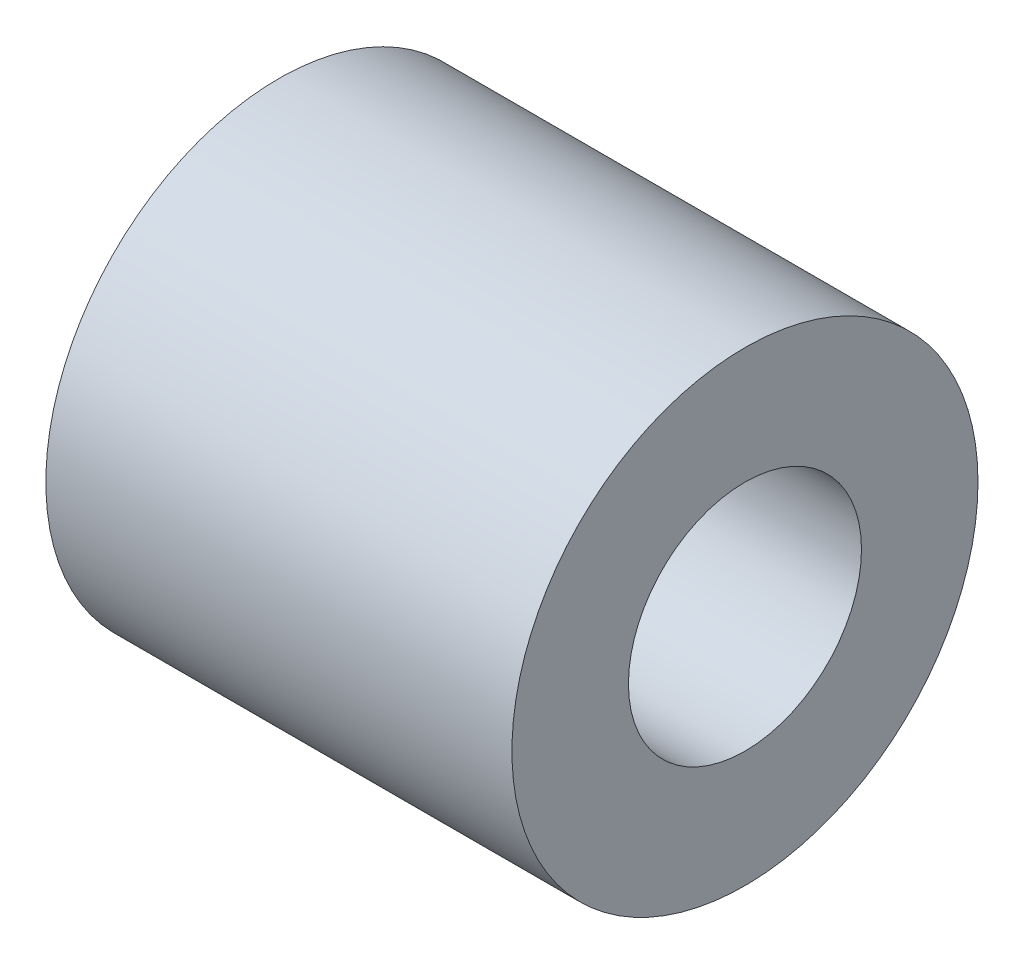
ISO-10303-21;
HEADER;
FILE_DESCRIPTION(('STEP AP214'),'2;1');
FILE_NAME('part.step','',(''),(''),'','','');
FILE_SCHEMA(('AUTOMOTIVE_DESIGN { 1 0 10303 214 1 1 1 1 }'));
ENDSEC;
DATA;
#1=APPLICATION_CONTEXT('core data for automotive mechanical design processes');
#2=APPLICATION_PROTOCOL_DEFINITION('international standard','automotive_design',2000,#1);
#3=PRODUCT_CONTEXT('',#1,'mechanical');
#4=PRODUCT('Part','Part','',(#3));
#5=PRODUCT_RELATED_PRODUCT_CATEGORY('part','',(#4));
#6=PRODUCT_DEFINITION_FORMATION('','',#4);
#7=PRODUCT_DEFINITION_CONTEXT('part definition',#1,'design');
#8=PRODUCT_DEFINITION('design','',#6,#7);
#9=PRODUCT_DEFINITION_SHAPE('','',#8);
#10=(LENGTH_UNIT() NAMED_UNIT(*) SI_UNIT(.MILLI.,.METRE.));
#11=(NAMED_UNIT(*) PLANE_ANGLE_UNIT() SI_UNIT($,.RADIAN.));
#12=(NAMED_UNIT(*) SI_UNIT($,.STERADIAN.) SOLID_ANGLE_UNIT());
#13=UNCERTAINTY_MEASURE_WITH_UNIT(LENGTH_MEASURE(1.E-05),#10,'distance_accuracy_value','');
#14=(GEOMETRIC_REPRESENTATION_CONTEXT(3) GLOBAL_UNCERTAINTY_ASSIGNED_CONTEXT((#13)) GLOBAL_UNIT_ASSIGNED_CONTEXT((#10,
#11,#12)) REPRESENTATION_CONTEXT('',''));
#15=CARTESIAN_POINT('',(0.,0.,0.));
#16=DIRECTION('',(0.,0.,1.));
#17=DIRECTION('',(1.,0.,0.));
#18=AXIS2_PLACEMENT_3D('',#15,#16,#17);
#19=CARTESIAN_POINT('',(2.,0.,0.));
#20=DIRECTION('',(-1.,0.,0.));
#21=DIRECTION('',(0.,0.,1.));
#22=AXIS2_PLACEMENT_3D('',#19,#20,#21);
#23=CYLINDRICAL_SURFACE('',#22,10.);
#24=CARTESIAN_POINT('',(0.,0.,0.));
#25=DIRECTION('',(1.,0.,0.));
#26=DIRECTION('',(0.,0.,-1.));
#27=AXIS2_PLACEMENT_3D('',#24,#25,#26);
#28=CIRCLE('',#27,10.);
#29=CARTESIAN_POINT('',(0.,0.,-10.));
#30=VERTEX_POINT('',#29);
#31=EDGE_CURVE('E41',#30,#30,#28,.T.);
#32=ORIENTED_EDGE('',*,*,#31,.T.);
#33=EDGE_LOOP('',(#32));
#34=FACE_BOUND('',#33,.T.);
#35=CARTESIAN_POINT('',(20.,0.,0.));
#36=DIRECTION('',(1.,0.,0.));
#37=DIRECTION('',(0.,0.,-1.));
#38=AXIS2_PLACEMENT_3D('',#35,#36,#37);
#39=CIRCLE('',#38,10.);
#40=CARTESIAN_POINT('',(20.,0.,-10.));
#41=VERTEX_POINT('',#40);
#42=EDGE_CURVE('E45',#41,#41,#39,.T.);
#43=ORIENTED_EDGE('',*,*,#42,.F.);
#44=EDGE_LOOP('',(#43));
#45=FACE_BOUND('',#44,.T.);
#46=ADVANCED_FACE('F35',(#34,#45),#23,.T.);
#47=CARTESIAN_POINT('',(0.,0.,0.));
#48=DIRECTION('',(1.,0.,0.));
#49=DIRECTION('',(0.,0.,-1.));
#50=AXIS2_PLACEMENT_3D('',#47,#48,#49);
#51=PLANE('',#50);
#52=ORIENTED_EDGE('',*,*,#31,.F.);
#53=EDGE_LOOP('',(#52));
#54=FACE_BOUND('',#53,.T.);
#55=ADVANCED_FACE('F59',(#54),#51,.F.);
#56=CARTESIAN_POINT('',(20.,0.,0.));
#57=DIRECTION('',(1.,0.,0.));
#58=DIRECTION('',(0.,0.,-1.));
#59=AXIS2_PLACEMENT_3D('',#56,#57,#58);
#60=PLANE('',#59);
#61=ORIENTED_EDGE('',*,*,#42,.T.);
#62=EDGE_LOOP('',(#61));
#63=FACE_BOUND('',#62,.T.);
#64=CARTESIAN_POINT('',(20.,0.,0.));
#65=DIRECTION('',(1.,0.,0.));
#66=DIRECTION('',(0.,0.,-1.));
#67=AXIS2_PLACEMENT_3D('',#64,#65,#66);
#68=CIRCLE('',#67,5.);
#69=CARTESIAN_POINT('',(20.,0.,-5.));
#70=VERTEX_POINT('',#69);
#71=EDGE_CURVE('E49',#70,#70,#68,.T.);
#72=ORIENTED_EDGE('',*,*,#71,.F.);
#73=EDGE_LOOP('',(#72));
#74=FACE_BOUND('',#73,.T.);
#75=ADVANCED_FACE('F57',(#63,#74),#60,.T.);
#76=CARTESIAN_POINT('',(20.,0.,0.));
#77=DIRECTION('',(-1.,0.,0.));
#78=DIRECTION('',(0.,0.,1.));
#79=AXIS2_PLACEMENT_3D('',#76,#77,#78);
#80=CYLINDRICAL_SURFACE('',#79,5.);
#81=ORIENTED_EDGE('',*,*,#71,.T.);
#82=EDGE_LOOP('',(#81));
#83=FACE_BOUND('',#82,.T.);
#84=CARTESIAN_POINT('',(2.,0.,0.));
#85=DIRECTION('',(1.,0.,0.));
#86=DIRECTION('',(0.,0.,-1.));
#87=AXIS2_PLACEMENT_3D('',#84,#85,#86);
#88=CIRCLE('',#87,5.);
#89=CARTESIAN_POINT('',(2.,0.,-5.));
#90=VERTEX_POINT('',#89);
#91=EDGE_CURVE('E10',#90,#90,#88,.F.);
#92=ORIENTED_EDGE('',*,*,#91,.T.);
#93=EDGE_LOOP('',(#92));
#94=FACE_BOUND('',#93,.T.);
#95=ADVANCED_FACE('F55',(#83,#94),#80,.F.);
#96=CARTESIAN_POINT('',(2.,0.,0.));
#97=DIRECTION('',(1.,0.,0.));
#98=DIRECTION('',(0.,0.,-1.));
#99=AXIS2_PLACEMENT_3D('',#96,#97,#98);
#100=PLANE('',#99);
#101=ORIENTED_EDGE('',*,*,#91,.F.);
#102=EDGE_LOOP('',(#101));
#103=FACE_BOUND('',#102,.T.);
#104=ADVANCED_FACE('F66',(#103),#100,.T.);
#105=CLOSED_SHELL('',(#46,#55,#75,#95,#104));
#106=MANIFOLD_SOLID_BREP('B2',#105);
#107=ADVANCED_BREP_SHAPE_REPRESENTATION('',(#18,#106),#14);
#108=SHAPE_DEFINITION_REPRESENTATION(#9,#107);
ENDSEC;
END-ISO-10303-21;
